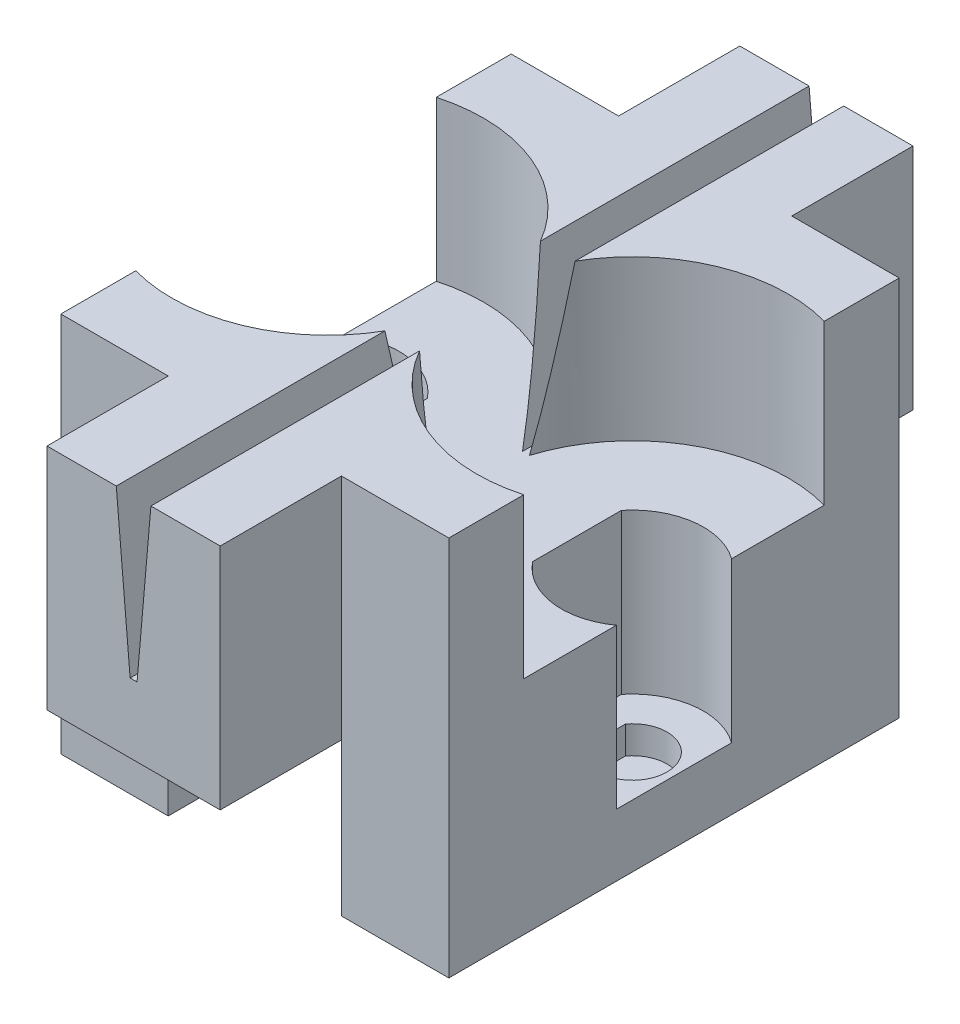
ISO-10303-21;
HEADER;
FILE_DESCRIPTION(('STEP AP214'),'2;1');
FILE_NAME('part.step','',(''),(''),'','','');
FILE_SCHEMA(('AUTOMOTIVE_DESIGN { 1 0 10303 214 1 1 1 1 }'));
ENDSEC;
DATA;
#1=APPLICATION_CONTEXT('core data for automotive mechanical design processes');
#2=APPLICATION_PROTOCOL_DEFINITION('international standard','automotive_design',2000,#1);
#3=PRODUCT_CONTEXT('',#1,'mechanical');
#4=PRODUCT('Part','Part','',(#3));
#5=PRODUCT_RELATED_PRODUCT_CATEGORY('part','',(#4));
#6=PRODUCT_DEFINITION_FORMATION('','',#4);
#7=PRODUCT_DEFINITION_CONTEXT('part definition',#1,'design');
#8=PRODUCT_DEFINITION('design','',#6,#7);
#9=PRODUCT_DEFINITION_SHAPE('','',#8);
#10=(LENGTH_UNIT() NAMED_UNIT(*) SI_UNIT(.MILLI.,.METRE.));
#11=(NAMED_UNIT(*) PLANE_ANGLE_UNIT() SI_UNIT($,.RADIAN.));
#12=(NAMED_UNIT(*) SI_UNIT($,.STERADIAN.) SOLID_ANGLE_UNIT());
#13=UNCERTAINTY_MEASURE_WITH_UNIT(LENGTH_MEASURE(1.E-05),#10,'distance_accuracy_value','');
#14=(GEOMETRIC_REPRESENTATION_CONTEXT(3) GLOBAL_UNCERTAINTY_ASSIGNED_CONTEXT((#13)) GLOBAL_UNIT_ASSIGNED_CONTEXT((#10,
#11,#12)) REPRESENTATION_CONTEXT('',''));
#15=CARTESIAN_POINT('',(0.,0.,0.));
#16=DIRECTION('',(0.,0.,1.));
#17=DIRECTION('',(1.,0.,0.));
#18=AXIS2_PLACEMENT_3D('',#15,#16,#17);
#19=CARTESIAN_POINT('',(0.,0.,0.));
#20=DIRECTION('',(0.,-1.,0.));
#21=DIRECTION('',(0.,0.,-1.));
#22=AXIS2_PLACEMENT_3D('',#19,#20,#21);
#23=PLANE('',#22);
#24=DIRECTION('',(0.,0.,1.));
#25=VECTOR('',#24,1.);
#26=CARTESIAN_POINT('',(-12.5,0.,-50.));
#27=LINE('',#26,#25);
#28=CARTESIAN_POINT('',(-12.5,0.,-32.5));
#29=VERTEX_POINT('',#28);
#30=CARTESIAN_POINT('',(-12.5,0.,32.5));
#31=VERTEX_POINT('',#30);
#32=EDGE_CURVE('E300',#29,#31,#27,.T.);
#33=ORIENTED_EDGE('',*,*,#32,.T.);
#34=DIRECTION('',(-1.,0.,0.));
#35=VECTOR('',#34,1.);
#36=CARTESIAN_POINT('',(-28.,0.,32.5));
#37=LINE('',#36,#35);
#38=CARTESIAN_POINT('',(-28.,0.,32.5));
#39=VERTEX_POINT('',#38);
#40=EDGE_CURVE('E611',#31,#39,#37,.T.);
#41=ORIENTED_EDGE('',*,*,#40,.T.);
#42=DIRECTION('',(0.,0.,1.));
#43=VECTOR('',#42,1.);
#44=CARTESIAN_POINT('',(-28.,0.,50.));
#45=LINE('',#44,#43);
#46=CARTESIAN_POINT('',(-28.,0.,-32.5));
#47=VERTEX_POINT('',#46);
#48=EDGE_CURVE('E467',#47,#39,#45,.T.);
#49=ORIENTED_EDGE('',*,*,#48,.F.);
#50=DIRECTION('',(1.,0.,0.));
#51=VECTOR('',#50,1.);
#52=CARTESIAN_POINT('',(-28.,0.,-32.5));
#53=LINE('',#52,#51);
#54=EDGE_CURVE('E318',#47,#29,#53,.T.);
#55=ORIENTED_EDGE('',*,*,#54,.T.);
#56=EDGE_LOOP('',(#33,#41,#49,#55));
#57=FACE_BOUND('',#56,.T.);
#58=ADVANCED_FACE('F35',(#57),#23,.T.);
#59=CARTESIAN_POINT('',(-14.,9.,-6.40800280898814));
#60=DIRECTION('',(-1.,0.,0.));
#61=DIRECTION('',(0.,0.,1.));
#62=AXIS2_PLACEMENT_3D('',#59,#60,#61);
#63=PLANE('',#62);
#64=DIRECTION('',(0.,0.,-1.));
#65=VECTOR('',#64,1.);
#66=CARTESIAN_POINT('',(-14.,32.,-50.));
#67=LINE('',#66,#65);
#68=CARTESIAN_POINT('',(-14.,32.,6.40800280898814));
#69=VERTEX_POINT('',#68);
#70=CARTESIAN_POINT('',(-14.,32.,-6.40800280898814));
#71=VERTEX_POINT('',#70);
#72=EDGE_CURVE('E340',#69,#71,#67,.T.);
#73=ORIENTED_EDGE('',*,*,#72,.T.);
#74=DIRECTION('',(0.,1.,0.));
#75=VECTOR('',#74,1.);
#76=CARTESIAN_POINT('',(-14.,9.,-6.40800280898814));
#77=LINE('',#76,#75);
#78=CARTESIAN_POINT('',(-14.,9.,-6.40800280898814));
#79=VERTEX_POINT('',#78);
#80=EDGE_CURVE('E337',#79,#71,#77,.T.);
#81=ORIENTED_EDGE('',*,*,#80,.F.);
#82=DIRECTION('',(0.,0.,1.));
#83=VECTOR('',#82,1.);
#84=CARTESIAN_POINT('',(-14.,9.,-6.40800280898814));
#85=LINE('',#84,#83);
#86=CARTESIAN_POINT('',(-14.,9.,6.40800280898814));
#87=VERTEX_POINT('',#86);
#88=EDGE_CURVE('E334',#79,#87,#85,.T.);
#89=ORIENTED_EDGE('',*,*,#88,.T.);
#90=DIRECTION('',(0.,1.,0.));
#91=VECTOR('',#90,1.);
#92=CARTESIAN_POINT('',(-14.,9.,6.40800280898814));
#93=LINE('',#92,#91);
#94=EDGE_CURVE('E336',#87,#69,#93,.T.);
#95=ORIENTED_EDGE('',*,*,#94,.T.);
#96=EDGE_LOOP('',(#73,#81,#89,#95));
#97=FACE_BOUND('',#96,.T.);
#98=ADVANCED_FACE('F584',(#97),#63,.T.);
#99=CARTESIAN_POINT('',(-22.,9.,0.));
#100=DIRECTION('',(0.,-1.,0.));
#101=DIRECTION('',(0.,0.,-1.));
#102=AXIS2_PLACEMENT_3D('',#99,#100,#101);
#103=PLANE('',#102);
#104=CARTESIAN_POINT('',(-22.,9.,0.));
#105=DIRECTION('',(0.,-1.,0.));
#106=DIRECTION('',(0.,0.,-1.));
#107=AXIS2_PLACEMENT_3D('',#104,#105,#106);
#108=CIRCLE('',#107,10.25);
#109=CARTESIAN_POINT('',(-28.,9.,8.3103850692973));
#110=VERTEX_POINT('',#109);
#111=EDGE_CURVE('E331',#87,#110,#108,.T.);
#112=ORIENTED_EDGE('',*,*,#111,.F.);
#113=ORIENTED_EDGE('',*,*,#88,.F.);
#114=CARTESIAN_POINT('',(-28.,9.,-8.31038506929733));
#115=VERTEX_POINT('',#114);
#116=EDGE_CURVE('E329',#115,#79,#108,.T.);
#117=ORIENTED_EDGE('',*,*,#116,.F.);
#118=DIRECTION('',(0.,0.,-1.));
#119=VECTOR('',#118,1.);
#120=CARTESIAN_POINT('',(-28.,9.,50.));
#121=LINE('',#120,#119);
#122=EDGE_CURVE('E11',#110,#115,#121,.T.);
#123=ORIENTED_EDGE('',*,*,#122,.F.);
#124=EDGE_LOOP('',(#112,#113,#117,#123));
#125=FACE_BOUND('',#124,.T.);
#126=CARTESIAN_POINT('',(-22.,9.,0.));
#127=DIRECTION('',(0.,-1.,0.));
#128=DIRECTION('',(0.,0.,-1.));
#129=AXIS2_PLACEMENT_3D('',#126,#127,#128);
#130=CIRCLE('',#129,5.);
#131=CARTESIAN_POINT('',(-18.,9.,3.));
#132=VERTEX_POINT('',#131);
#133=CARTESIAN_POINT('',(-18.,9.,-3.));
#134=VERTEX_POINT('',#133);
#135=EDGE_CURVE('E58',#132,#134,#130,.T.);
#136=ORIENTED_EDGE('',*,*,#135,.T.);
#137=DIRECTION('',(0.,0.,1.));
#138=VECTOR('',#137,1.);
#139=CARTESIAN_POINT('',(-18.,9.,-3.));
#140=LINE('',#139,#138);
#141=EDGE_CURVE('E309',#134,#132,#140,.T.);
#142=ORIENTED_EDGE('',*,*,#141,.T.);
#143=EDGE_LOOP('',(#136,#142));
#144=FACE_BOUND('',#143,.T.);
#145=ADVANCED_FACE('F591',(#125,#144),#103,.F.);
#146=CARTESIAN_POINT('',(-28.,55.,50.));
#147=DIRECTION('',(1.,0.,0.));
#148=DIRECTION('',(0.,0.,-1.));
#149=AXIS2_PLACEMENT_3D('',#146,#147,#148);
#150=PLANE('',#149);
#151=ORIENTED_EDGE('',*,*,#48,.T.);
#152=DIRECTION('',(0.,1.,0.));
#153=VECTOR('',#152,1.);
#154=CARTESIAN_POINT('',(-28.,0.,32.5));
#155=LINE('',#154,#153);
#156=CARTESIAN_POINT('',(-28.,55.,32.5));
#157=VERTEX_POINT('',#156);
#158=EDGE_CURVE('E636',#39,#157,#155,.T.);
#159=ORIENTED_EDGE('',*,*,#158,.T.);
#160=DIRECTION('',(0.,0.,1.));
#161=VECTOR('',#160,1.);
#162=CARTESIAN_POINT('',(-28.,55.,50.));
#163=LINE('',#162,#161);
#164=CARTESIAN_POINT('',(-28.,55.,21.6852484422014));
#165=VERTEX_POINT('',#164);
#166=EDGE_CURVE('E458',#165,#157,#163,.T.);
#167=ORIENTED_EDGE('',*,*,#166,.F.);
#168=DIRECTION('',(0.,1.,0.));
#169=VECTOR('',#168,1.);
#170=CARTESIAN_POINT('',(-28.,32.,21.6852484422014));
#171=LINE('',#170,#169);
#172=CARTESIAN_POINT('',(-28.,32.,21.6852484422014));
#173=VERTEX_POINT('',#172);
#174=EDGE_CURVE('E356',#173,#165,#171,.T.);
#175=ORIENTED_EDGE('',*,*,#174,.F.);
#176=DIRECTION('',(0.,0.,1.));
#177=VECTOR('',#176,1.);
#178=CARTESIAN_POINT('',(-28.,32.,50.));
#179=LINE('',#178,#177);
#180=CARTESIAN_POINT('',(-28.,32.,8.3103850692973));
#181=VERTEX_POINT('',#180);
#182=EDGE_CURVE('E360',#181,#173,#179,.T.);
#183=ORIENTED_EDGE('',*,*,#182,.F.);
#184=DIRECTION('',(0.,1.,0.));
#185=VECTOR('',#184,1.);
#186=CARTESIAN_POINT('',(-28.,9.,8.3103850692973));
#187=LINE('',#186,#185);
#188=EDGE_CURVE('E344',#110,#181,#187,.T.);
#189=ORIENTED_EDGE('',*,*,#188,.F.);
#190=ORIENTED_EDGE('',*,*,#122,.T.);
#191=DIRECTION('',(0.,1.,0.));
#192=VECTOR('',#191,1.);
#193=CARTESIAN_POINT('',(-28.,9.,-8.31038506929733));
#194=LINE('',#193,#192);
#195=CARTESIAN_POINT('',(-28.,32.,-8.31038506929733));
#196=VERTEX_POINT('',#195);
#197=EDGE_CURVE('E346',#196,#115,#194,.F.);
#198=ORIENTED_EDGE('',*,*,#197,.F.);
#199=CARTESIAN_POINT('',(-28.,32.,-21.6852484422015));
#200=VERTEX_POINT('',#199);
#201=EDGE_CURVE('E362',#200,#196,#179,.T.);
#202=ORIENTED_EDGE('',*,*,#201,.F.);
#203=DIRECTION('',(0.,1.,0.));
#204=VECTOR('',#203,1.);
#205=CARTESIAN_POINT('',(-28.,32.,-21.6852484422015));
#206=LINE('',#205,#204);
#207=CARTESIAN_POINT('',(-28.,55.,-21.6852484422015));
#208=VERTEX_POINT('',#207);
#209=EDGE_CURVE('E358',#208,#200,#206,.F.);
#210=ORIENTED_EDGE('',*,*,#209,.F.);
#211=CARTESIAN_POINT('',(-28.,55.,-32.5));
#212=VERTEX_POINT('',#211);
#213=EDGE_CURVE('E459',#212,#208,#163,.T.);
#214=ORIENTED_EDGE('',*,*,#213,.F.);
#215=DIRECTION('',(0.,1.,0.));
#216=VECTOR('',#215,1.);
#217=CARTESIAN_POINT('',(-28.,0.,-32.5));
#218=LINE('',#217,#216);
#219=EDGE_CURVE('E316',#47,#212,#218,.T.);
#220=ORIENTED_EDGE('',*,*,#219,.F.);
#221=EDGE_LOOP('',(#151,#159,#167,#175,#183,#189,#190,#198,#202,#210,#214,#220));
#222=FACE_BOUND('',#221,.T.);
#223=ADVANCED_FACE('F580',(#222),#150,.F.);
#224=CARTESIAN_POINT('',(-0.5,32.,-50.));
#225=DIRECTION('',(0.,-1.,0.));
#226=DIRECTION('',(0.,0.,-1.));
#227=AXIS2_PLACEMENT_3D('',#224,#225,#226);
#228=PLANE('',#227);
#229=ORIENTED_EDGE('',*,*,#72,.F.);
#230=CARTESIAN_POINT('',(-22.,32.,0.));
#231=DIRECTION('',(0.,-1.,0.));
#232=DIRECTION('',(0.,0.,-1.));
#233=AXIS2_PLACEMENT_3D('',#230,#231,#232);
#234=CIRCLE('',#233,10.25);
#235=EDGE_CURVE('E43',#181,#69,#234,.F.);
#236=ORIENTED_EDGE('',*,*,#235,.F.);
#237=ORIENTED_EDGE('',*,*,#182,.T.);
#238=CARTESIAN_POINT('',(-22.,32.,0.));
#239=DIRECTION('',(0.,-1.,0.));
#240=DIRECTION('',(0.,0.,1.));
#241=AXIS2_PLACEMENT_3D('',#238,#239,#240);
#242=CIRCLE('',#241,22.5);
#243=CARTESIAN_POINT('',(-0.500000000000006,32.,6.63324958071084));
#244=VERTEX_POINT('',#243);
#245=EDGE_CURVE('E349',#244,#173,#242,.T.);
#246=ORIENTED_EDGE('',*,*,#245,.F.);
#247=DIRECTION('',(0.,0.,1.));
#248=VECTOR('',#247,1.);
#249=CARTESIAN_POINT('',(-0.5,32.,-50.));
#250=LINE('',#249,#248);
#251=CARTESIAN_POINT('',(-0.5,32.,50.));
#252=VERTEX_POINT('',#251);
#253=EDGE_CURVE('E440',#244,#252,#250,.T.);
#254=ORIENTED_EDGE('',*,*,#253,.T.);
#255=DIRECTION('',(1.,0.,0.));
#256=VECTOR('',#255,1.);
#257=CARTESIAN_POINT('',(-0.5,32.,50.));
#258=LINE('',#257,#256);
#259=CARTESIAN_POINT('',(0.5,32.,50.));
#260=VERTEX_POINT('',#259);
#261=EDGE_CURVE('E417',#252,#260,#258,.T.);
#262=ORIENTED_EDGE('',*,*,#261,.T.);
#263=DIRECTION('',(0.,0.,1.));
#264=VECTOR('',#263,1.);
#265=CARTESIAN_POINT('',(0.5,32.,-50.));
#266=LINE('',#265,#264);
#267=CARTESIAN_POINT('',(0.500000000000007,32.,6.63324958071084));
#268=VERTEX_POINT('',#267);
#269=EDGE_CURVE('E428',#268,#260,#266,.T.);
#270=ORIENTED_EDGE('',*,*,#269,.F.);
#271=CARTESIAN_POINT('',(22.,32.,0.));
#272=DIRECTION('',(0.,1.,0.));
#273=DIRECTION('',(0.,0.,1.));
#274=AXIS2_PLACEMENT_3D('',#271,#272,#273);
#275=CIRCLE('',#274,22.5);
#276=CARTESIAN_POINT('',(28.,32.,21.6852484422014));
#277=VERTEX_POINT('',#276);
#278=EDGE_CURVE('E401',#268,#277,#275,.T.);
#279=ORIENTED_EDGE('',*,*,#278,.T.);
#280=DIRECTION('',(0.,0.,-1.));
#281=VECTOR('',#280,1.);
#282=CARTESIAN_POINT('',(28.,32.,50.));
#283=LINE('',#282,#281);
#284=CARTESIAN_POINT('',(28.,32.,8.3103850692973));
#285=VERTEX_POINT('',#284);
#286=EDGE_CURVE('E410',#277,#285,#283,.T.);
#287=ORIENTED_EDGE('',*,*,#286,.T.);
#288=CARTESIAN_POINT('',(22.,32.,0.));
#289=DIRECTION('',(0.,-1.,0.));
#290=DIRECTION('',(0.,0.,-1.));
#291=AXIS2_PLACEMENT_3D('',#288,#289,#290);
#292=CIRCLE('',#291,10.25);
#293=CARTESIAN_POINT('',(14.,32.,6.40800280898814));
#294=VERTEX_POINT('',#293);
#295=EDGE_CURVE('E476',#285,#294,#292,.T.);
#296=ORIENTED_EDGE('',*,*,#295,.T.);
#297=DIRECTION('',(0.,0.,-1.));
#298=VECTOR('',#297,1.);
#299=CARTESIAN_POINT('',(14.,32.,-50.));
#300=LINE('',#299,#298);
#301=CARTESIAN_POINT('',(14.,32.,-6.40800280898814));
#302=VERTEX_POINT('',#301);
#303=EDGE_CURVE('E390',#294,#302,#300,.T.);
#304=ORIENTED_EDGE('',*,*,#303,.T.);
#305=CARTESIAN_POINT('',(28.,32.,-8.31038506929733));
#306=VERTEX_POINT('',#305);
#307=EDGE_CURVE('E473',#302,#306,#292,.T.);
#308=ORIENTED_EDGE('',*,*,#307,.T.);
#309=CARTESIAN_POINT('',(28.,32.,-21.6852484422015));
#310=VERTEX_POINT('',#309);
#311=EDGE_CURVE('E408',#306,#310,#283,.T.);
#312=ORIENTED_EDGE('',*,*,#311,.T.);
#313=CARTESIAN_POINT('',(0.5,32.,-6.63324958071086));
#314=VERTEX_POINT('',#313);
#315=EDGE_CURVE('E404',#310,#314,#275,.T.);
#316=ORIENTED_EDGE('',*,*,#315,.T.);
#317=CARTESIAN_POINT('',(0.5,32.,-50.));
#318=VERTEX_POINT('',#317);
#319=EDGE_CURVE('E449',#318,#314,#266,.T.);
#320=ORIENTED_EDGE('',*,*,#319,.F.);
#321=DIRECTION('',(1.,0.,0.));
#322=VECTOR('',#321,1.);
#323=CARTESIAN_POINT('',(-0.5,32.,-50.));
#324=LINE('',#323,#322);
#325=CARTESIAN_POINT('',(-0.5,32.,-50.));
#326=VERTEX_POINT('',#325);
#327=EDGE_CURVE('E418',#326,#318,#324,.T.);
#328=ORIENTED_EDGE('',*,*,#327,.F.);
#329=CARTESIAN_POINT('',(-0.5,32.,-6.63324958071086));
#330=VERTEX_POINT('',#329);
#331=EDGE_CURVE('E436',#326,#330,#250,.T.);
#332=ORIENTED_EDGE('',*,*,#331,.T.);
#333=EDGE_CURVE('E352',#200,#330,#242,.T.);
#334=ORIENTED_EDGE('',*,*,#333,.F.);
#335=ORIENTED_EDGE('',*,*,#201,.T.);
#336=EDGE_CURVE('E482',#71,#196,#234,.F.);
#337=ORIENTED_EDGE('',*,*,#336,.F.);
#338=EDGE_LOOP('',(#229,#236,#237,#246,#254,#262,#270,#279,#287,#296,#304,#308,#312,#316,#320,
#328,#332,#334,#335,#337));
#339=FACE_BOUND('',#338,.T.);
#340=ADVANCED_FACE('F497',(#339),#228,.F.);
#341=CARTESIAN_POINT('',(0.,55.,0.));
#342=DIRECTION('',(0.,-1.,0.));
#343=DIRECTION('',(0.,0.,-1.));
#344=AXIS2_PLACEMENT_3D('',#341,#342,#343);
#345=PLANE('',#344);
#346=ORIENTED_EDGE('',*,*,#166,.T.);
#347=DIRECTION('',(-1.,0.,0.));
#348=VECTOR('',#347,1.);
#349=CARTESIAN_POINT('',(-28.,55.,32.5));
#350=LINE('',#349,#348);
#351=CARTESIAN_POINT('',(-12.5,55.,32.5));
#352=VERTEX_POINT('',#351);
#353=EDGE_CURVE('E616',#352,#157,#350,.T.);
#354=ORIENTED_EDGE('',*,*,#353,.F.);
#355=DIRECTION('',(0.,0.,-1.));
#356=VECTOR('',#355,1.);
#357=CARTESIAN_POINT('',(-12.5,55.,50.));
#358=LINE('',#357,#356);
#359=CARTESIAN_POINT('',(-12.5,55.,50.));
#360=VERTEX_POINT('',#359);
#361=EDGE_CURVE('E604',#360,#352,#358,.T.);
#362=ORIENTED_EDGE('',*,*,#361,.F.);
#363=DIRECTION('',(1.,0.,0.));
#364=VECTOR('',#363,1.);
#365=CARTESIAN_POINT('',(-28.,55.,50.));
#366=LINE('',#365,#364);
#367=CARTESIAN_POINT('',(-2.5,55.,50.));
#368=VERTEX_POINT('',#367);
#369=EDGE_CURVE('E462',#360,#368,#366,.T.);
#370=ORIENTED_EDGE('',*,*,#369,.T.);
#371=DIRECTION('',(0.,0.,1.));
#372=VECTOR('',#371,1.);
#373=CARTESIAN_POINT('',(-2.5,55.,-50.));
#374=LINE('',#373,#372);
#375=CARTESIAN_POINT('',(-2.50000000000001,55.,11.2249721603218));
#376=VERTEX_POINT('',#375);
#377=EDGE_CURVE('E444',#376,#368,#374,.T.);
#378=ORIENTED_EDGE('',*,*,#377,.F.);
#379=CARTESIAN_POINT('',(-22.,55.,0.));
#380=DIRECTION('',(0.,-1.,0.));
#381=DIRECTION('',(0.,0.,1.));
#382=AXIS2_PLACEMENT_3D('',#379,#380,#381);
#383=CIRCLE('',#382,22.5);
#384=EDGE_CURVE('E348',#376,#165,#383,.T.);
#385=ORIENTED_EDGE('',*,*,#384,.T.);
#386=EDGE_LOOP('',(#346,#354,#362,#370,#378,#385));
#387=FACE_BOUND('',#386,.T.);
#388=ADVANCED_FACE('F600',(#387),#345,.F.);
#389=CARTESIAN_POINT('',(-0.5,32.,-50.));
#390=DIRECTION('',(-0.996240588195683,-0.0866296163648421,0.));
#391=DIRECTION('',(0.0866296163648421,-0.996240588195683,0.));
#392=AXIS2_PLACEMENT_3D('',#389,#390,#391);
#393=PLANE('',#392);
#394=CARTESIAN_POINT('',(-22.,279.25,0.));
#395=DIRECTION('',(-0.996240588195683,-0.0866296163648421,0.));
#396=DIRECTION('',(-0.0866296163648421,0.996240588195683,0.));
#397=AXIS2_PLACEMENT_3D('',#394,#395,#396);
#398=ELLIPSE('',#397,259.726418563842,22.5);
#399=EDGE_CURVE('E481',#376,#244,#398,.F.);
#400=ORIENTED_EDGE('',*,*,#399,.F.);
#401=ORIENTED_EDGE('',*,*,#377,.T.);
#402=DIRECTION('',(0.0866296163648421,-0.996240588195683,0.));
#403=VECTOR('',#402,1.);
#404=CARTESIAN_POINT('',(-0.5,32.,50.));
#405=LINE('',#404,#403);
#406=EDGE_CURVE('E422',#368,#252,#405,.T.);
#407=ORIENTED_EDGE('',*,*,#406,.T.);
#408=ORIENTED_EDGE('',*,*,#253,.F.);
#409=EDGE_LOOP('',(#400,#401,#407,#408));
#410=FACE_BOUND('',#409,.T.);
#411=ADVANCED_FACE('F500',(#410),#393,.F.);
#412=CARTESIAN_POINT('',(14.,9.,-6.40800280898814));
#413=DIRECTION('',(-1.,0.,0.));
#414=DIRECTION('',(0.,0.,1.));
#415=AXIS2_PLACEMENT_3D('',#412,#413,#414);
#416=PLANE('',#415);
#417=DIRECTION('',(0.,1.,0.));
#418=VECTOR('',#417,1.);
#419=CARTESIAN_POINT('',(14.,9.,-6.40800280898814));
#420=LINE('',#419,#418);
#421=CARTESIAN_POINT('',(14.,9.,-6.40800280898814));
#422=VERTEX_POINT('',#421);
#423=EDGE_CURVE('E386',#422,#302,#420,.T.);
#424=ORIENTED_EDGE('',*,*,#423,.T.);
#425=ORIENTED_EDGE('',*,*,#303,.F.);
#426=DIRECTION('',(0.,1.,0.));
#427=VECTOR('',#426,1.);
#428=CARTESIAN_POINT('',(14.,9.,6.40800280898814));
#429=LINE('',#428,#427);
#430=CARTESIAN_POINT('',(14.,9.,6.40800280898814));
#431=VERTEX_POINT('',#430);
#432=EDGE_CURVE('E387',#431,#294,#429,.T.);
#433=ORIENTED_EDGE('',*,*,#432,.F.);
#434=DIRECTION('',(0.,0.,1.));
#435=VECTOR('',#434,1.);
#436=CARTESIAN_POINT('',(14.,9.,-6.40800280898814));
#437=LINE('',#436,#435);
#438=EDGE_CURVE('E383',#422,#431,#437,.T.);
#439=ORIENTED_EDGE('',*,*,#438,.F.);
#440=EDGE_LOOP('',(#424,#425,#433,#439));
#441=FACE_BOUND('',#440,.T.);
#442=ADVANCED_FACE('F537',(#441),#416,.F.);
#443=CARTESIAN_POINT('',(2.5,55.,50.));
#444=VERTEX_POINT('',#443);
#445=CARTESIAN_POINT('',(12.5,55.,50.));
#446=VERTEX_POINT('',#445);
#447=EDGE_CURVE('E461',#444,#446,#366,.T.);
#448=ORIENTED_EDGE('',*,*,#447,.T.);
#449=DIRECTION('',(0.,0.,1.));
#450=VECTOR('',#449,1.);
#451=CARTESIAN_POINT('',(12.5,55.,50.));
#452=LINE('',#451,#450);
#453=CARTESIAN_POINT('',(12.5,55.,32.5));
#454=VERTEX_POINT('',#453);
#455=EDGE_CURVE('E658',#454,#446,#452,.T.);
#456=ORIENTED_EDGE('',*,*,#455,.F.);
#457=DIRECTION('',(-1.,0.,0.));
#458=VECTOR('',#457,1.);
#459=CARTESIAN_POINT('',(28.,55.,32.5));
#460=LINE('',#459,#458);
#461=CARTESIAN_POINT('',(28.,55.,32.5));
#462=VERTEX_POINT('',#461);
#463=EDGE_CURVE('E289',#462,#454,#460,.T.);
#464=ORIENTED_EDGE('',*,*,#463,.F.);
#465=DIRECTION('',(0.,0.,-1.));
#466=VECTOR('',#465,1.);
#467=CARTESIAN_POINT('',(28.,55.,50.));
#468=LINE('',#467,#466);
#469=CARTESIAN_POINT('',(28.,55.,21.6852484422014));
#470=VERTEX_POINT('',#469);
#471=EDGE_CURVE('E452',#462,#470,#468,.T.);
#472=ORIENTED_EDGE('',*,*,#471,.T.);
#473=CARTESIAN_POINT('',(22.,55.,0.));
#474=DIRECTION('',(0.,1.,0.));
#475=DIRECTION('',(0.,0.,1.));
#476=AXIS2_PLACEMENT_3D('',#473,#474,#475);
#477=CIRCLE('',#476,22.5);
#478=CARTESIAN_POINT('',(2.50000000000001,55.,11.2249721603218));
#479=VERTEX_POINT('',#478);
#480=EDGE_CURVE('E400',#479,#470,#477,.T.);
#481=ORIENTED_EDGE('',*,*,#480,.F.);
#482=DIRECTION('',(0.,0.,1.));
#483=VECTOR('',#482,1.);
#484=CARTESIAN_POINT('',(2.5,55.,-50.));
#485=LINE('',#484,#483);
#486=EDGE_CURVE('E448',#479,#444,#485,.T.);
#487=ORIENTED_EDGE('',*,*,#486,.T.);
#488=EDGE_LOOP('',(#448,#456,#464,#472,#481,#487));
#489=FACE_BOUND('',#488,.T.);
#490=ADVANCED_FACE('F521',(#489),#345,.F.);
#491=CARTESIAN_POINT('',(2.5,55.,-50.));
#492=DIRECTION('',(0.996240588195683,-0.0866296163648419,0.));
#493=DIRECTION('',(0.0866296163648419,0.996240588195683,0.));
#494=AXIS2_PLACEMENT_3D('',#491,#492,#493);
#495=PLANE('',#494);
#496=ORIENTED_EDGE('',*,*,#486,.F.);
#497=CARTESIAN_POINT('',(22.,279.25,0.));
#498=DIRECTION('',(0.996240588195683,-0.0866296163648419,0.));
#499=DIRECTION('',(0.0866296163648419,0.996240588195683,0.));
#500=AXIS2_PLACEMENT_3D('',#497,#498,#499);
#501=ELLIPSE('',#500,259.726418563842,22.5);
#502=EDGE_CURVE('E472',#479,#268,#501,.T.);
#503=ORIENTED_EDGE('',*,*,#502,.T.);
#504=ORIENTED_EDGE('',*,*,#269,.T.);
#505=DIRECTION('',(0.0866296163648419,0.996240588195683,0.));
#506=VECTOR('',#505,1.);
#507=CARTESIAN_POINT('',(2.5,55.,50.));
#508=LINE('',#507,#506);
#509=EDGE_CURVE('E431',#260,#444,#508,.T.);
#510=ORIENTED_EDGE('',*,*,#509,.T.);
#511=EDGE_LOOP('',(#496,#503,#504,#510));
#512=FACE_BOUND('',#511,.T.);
#513=ADVANCED_FACE('F515',(#512),#495,.F.);
#514=DIRECTION('',(-1.,0.,0.));
#515=VECTOR('',#514,1.);
#516=CARTESIAN_POINT('',(-28.,55.,-50.));
#517=LINE('',#516,#515);
#518=CARTESIAN_POINT('',(-2.5,55.,-50.));
#519=VERTEX_POINT('',#518);
#520=CARTESIAN_POINT('',(-12.5,55.,-50.));
#521=VERTEX_POINT('',#520);
#522=EDGE_CURVE('E454',#519,#521,#517,.T.);
#523=ORIENTED_EDGE('',*,*,#522,.T.);
#524=DIRECTION('',(0.,0.,-1.));
#525=VECTOR('',#524,1.);
#526=CARTESIAN_POINT('',(-12.5,55.,-50.));
#527=LINE('',#526,#525);
#528=CARTESIAN_POINT('',(-12.5,55.,-32.5));
#529=VERTEX_POINT('',#528);
#530=EDGE_CURVE('E305',#529,#521,#527,.T.);
#531=ORIENTED_EDGE('',*,*,#530,.F.);
#532=DIRECTION('',(1.,0.,0.));
#533=VECTOR('',#532,1.);
#534=CARTESIAN_POINT('',(-28.,55.,-32.5));
#535=LINE('',#534,#533);
#536=EDGE_CURVE('E577',#212,#529,#535,.T.);
#537=ORIENTED_EDGE('',*,*,#536,.F.);
#538=ORIENTED_EDGE('',*,*,#213,.T.);
#539=CARTESIAN_POINT('',(-2.50000000000001,55.,-11.2249721603219));
#540=VERTEX_POINT('',#539);
#541=EDGE_CURVE('E353',#208,#540,#383,.T.);
#542=ORIENTED_EDGE('',*,*,#541,.T.);
#543=EDGE_CURVE('E441',#519,#540,#374,.T.);
#544=ORIENTED_EDGE('',*,*,#543,.F.);
#545=EDGE_LOOP('',(#523,#531,#537,#538,#542,#544));
#546=FACE_BOUND('',#545,.T.);
#547=ADVANCED_FACE('F573',(#546),#345,.F.);
#548=CARTESIAN_POINT('',(28.,55.,50.));
#549=DIRECTION('',(-1.,0.,0.));
#550=DIRECTION('',(0.,0.,1.));
#551=AXIS2_PLACEMENT_3D('',#548,#549,#550);
#552=PLANE('',#551);
#553=DIRECTION('',(0.,0.,-1.));
#554=VECTOR('',#553,1.);
#555=CARTESIAN_POINT('',(28.,0.,50.));
#556=LINE('',#555,#554);
#557=CARTESIAN_POINT('',(28.,0.,32.5));
#558=VERTEX_POINT('',#557);
#559=CARTESIAN_POINT('',(28.,0.,-32.5));
#560=VERTEX_POINT('',#559);
#561=EDGE_CURVE('E439',#558,#560,#556,.T.);
#562=ORIENTED_EDGE('',*,*,#561,.T.);
#563=DIRECTION('',(0.,1.,0.));
#564=VECTOR('',#563,1.);
#565=CARTESIAN_POINT('',(28.,0.,-32.5));
#566=LINE('',#565,#564);
#567=CARTESIAN_POINT('',(28.,55.,-32.5));
#568=VERTEX_POINT('',#567);
#569=EDGE_CURVE('E621',#560,#568,#566,.T.);
#570=ORIENTED_EDGE('',*,*,#569,.T.);
#571=CARTESIAN_POINT('',(28.,55.,-21.6852484422015));
#572=VERTEX_POINT('',#571);
#573=EDGE_CURVE('E455',#572,#568,#468,.T.);
#574=ORIENTED_EDGE('',*,*,#573,.F.);
#575=DIRECTION('',(0.,1.,0.));
#576=VECTOR('',#575,1.);
#577=CARTESIAN_POINT('',(28.,32.,-21.6852484422015));
#578=LINE('',#577,#576);
#579=EDGE_CURVE('E411',#572,#310,#578,.F.);
#580=ORIENTED_EDGE('',*,*,#579,.T.);
#581=ORIENTED_EDGE('',*,*,#311,.F.);
#582=DIRECTION('',(0.,1.,0.));
#583=VECTOR('',#582,1.);
#584=CARTESIAN_POINT('',(28.,9.,-8.31038506929733));
#585=LINE('',#584,#583);
#586=CARTESIAN_POINT('',(28.,9.,-8.31038506929733));
#587=VERTEX_POINT('',#586);
#588=EDGE_CURVE('E397',#306,#587,#585,.F.);
#589=ORIENTED_EDGE('',*,*,#588,.T.);
#590=DIRECTION('',(0.,0.,1.));
#591=VECTOR('',#590,1.);
#592=CARTESIAN_POINT('',(28.,9.,50.));
#593=LINE('',#592,#591);
#594=CARTESIAN_POINT('',(28.,9.,8.3103850692973));
#595=VERTEX_POINT('',#594);
#596=EDGE_CURVE('E477',#587,#595,#593,.T.);
#597=ORIENTED_EDGE('',*,*,#596,.T.);
#598=DIRECTION('',(0.,1.,0.));
#599=VECTOR('',#598,1.);
#600=CARTESIAN_POINT('',(28.,9.,8.3103850692973));
#601=LINE('',#600,#599);
#602=EDGE_CURVE('E394',#595,#285,#601,.T.);
#603=ORIENTED_EDGE('',*,*,#602,.T.);
#604=ORIENTED_EDGE('',*,*,#286,.F.);
#605=DIRECTION('',(0.,1.,0.));
#606=VECTOR('',#605,1.);
#607=CARTESIAN_POINT('',(28.,32.,21.6852484422014));
#608=LINE('',#607,#606);
#609=EDGE_CURVE('E414',#277,#470,#608,.T.);
#610=ORIENTED_EDGE('',*,*,#609,.T.);
#611=ORIENTED_EDGE('',*,*,#471,.F.);
#612=DIRECTION('',(0.,1.,0.));
#613=VECTOR('',#612,1.);
#614=CARTESIAN_POINT('',(28.,0.,32.5));
#615=LINE('',#614,#613);
#616=EDGE_CURVE('E528',#558,#462,#615,.T.);
#617=ORIENTED_EDGE('',*,*,#616,.F.);
#618=EDGE_LOOP('',(#562,#570,#574,#580,#581,#589,#597,#603,#604,#610,#611,#617));
#619=FACE_BOUND('',#618,.T.);
#620=ADVANCED_FACE('F37',(#619),#552,.F.);
#621=CARTESIAN_POINT('',(-28.,55.,-50.));
#622=DIRECTION('',(0.,0.,1.));
#623=DIRECTION('',(1.,0.,0.));
#624=AXIS2_PLACEMENT_3D('',#621,#622,#623);
#625=PLANE('',#624);
#626=DIRECTION('',(0.,1.,0.));
#627=VECTOR('',#626,1.);
#628=CARTESIAN_POINT('',(12.5,0.,-50.));
#629=LINE('',#628,#627);
#630=CARTESIAN_POINT('',(12.5,22.,-50.));
#631=VERTEX_POINT('',#630);
#632=CARTESIAN_POINT('',(12.5,55.,-50.));
#633=VERTEX_POINT('',#632);
#634=EDGE_CURVE('E299',#631,#633,#629,.T.);
#635=ORIENTED_EDGE('',*,*,#634,.F.);
#636=DIRECTION('',(-1.,0.,0.));
#637=VECTOR('',#636,1.);
#638=CARTESIAN_POINT('',(-12.5,22.,-50.));
#639=LINE('',#638,#637);
#640=CARTESIAN_POINT('',(-12.5,22.,-50.));
#641=VERTEX_POINT('',#640);
#642=EDGE_CURVE('E50',#631,#641,#639,.T.);
#643=ORIENTED_EDGE('',*,*,#642,.T.);
#644=DIRECTION('',(0.,1.,0.));
#645=VECTOR('',#644,1.);
#646=CARTESIAN_POINT('',(-12.5,0.,-50.));
#647=LINE('',#646,#645);
#648=EDGE_CURVE('E296',#641,#521,#647,.T.);
#649=ORIENTED_EDGE('',*,*,#648,.T.);
#650=ORIENTED_EDGE('',*,*,#522,.F.);
#651=DIRECTION('',(0.0866296163648421,-0.996240588195683,0.));
#652=VECTOR('',#651,1.);
#653=CARTESIAN_POINT('',(-0.5,32.,-50.));
#654=LINE('',#653,#652);
#655=EDGE_CURVE('E425',#519,#326,#654,.T.);
#656=ORIENTED_EDGE('',*,*,#655,.T.);
#657=ORIENTED_EDGE('',*,*,#327,.T.);
#658=DIRECTION('',(0.0866296163648419,0.996240588195683,0.));
#659=VECTOR('',#658,1.);
#660=CARTESIAN_POINT('',(2.5,55.,-50.));
#661=LINE('',#660,#659);
#662=CARTESIAN_POINT('',(2.5,55.,-50.));
#663=VERTEX_POINT('',#662);
#664=EDGE_CURVE('E421',#318,#663,#661,.T.);
#665=ORIENTED_EDGE('',*,*,#664,.T.);
#666=EDGE_CURVE('E456',#633,#663,#517,.T.);
#667=ORIENTED_EDGE('',*,*,#666,.F.);
#668=EDGE_LOOP('',(#635,#643,#649,#650,#656,#657,#665,#667));
#669=FACE_BOUND('',#668,.T.);
#670=ADVANCED_FACE('F294',(#669),#625,.F.);
#671=CARTESIAN_POINT('',(-28.,55.,50.));
#672=DIRECTION('',(0.,0.,-1.));
#673=DIRECTION('',(-1.,0.,0.));
#674=AXIS2_PLACEMENT_3D('',#671,#672,#673);
#675=PLANE('',#674);
#676=DIRECTION('',(0.,1.,0.));
#677=VECTOR('',#676,1.);
#678=CARTESIAN_POINT('',(-12.5,0.,50.));
#679=LINE('',#678,#677);
#680=CARTESIAN_POINT('',(-12.5,22.,50.));
#681=VERTEX_POINT('',#680);
#682=EDGE_CURVE('E606',#681,#360,#679,.T.);
#683=ORIENTED_EDGE('',*,*,#682,.F.);
#684=DIRECTION('',(-1.,0.,0.));
#685=VECTOR('',#684,1.);
#686=CARTESIAN_POINT('',(-12.5,22.,50.));
#687=LINE('',#686,#685);
#688=CARTESIAN_POINT('',(12.5,22.,50.));
#689=VERTEX_POINT('',#688);
#690=EDGE_CURVE('E301',#689,#681,#687,.T.);
#691=ORIENTED_EDGE('',*,*,#690,.F.);
#692=DIRECTION('',(0.,1.,0.));
#693=VECTOR('',#692,1.);
#694=CARTESIAN_POINT('',(12.5,0.,50.));
#695=LINE('',#694,#693);
#696=EDGE_CURVE('E635',#689,#446,#695,.T.);
#697=ORIENTED_EDGE('',*,*,#696,.T.);
#698=ORIENTED_EDGE('',*,*,#447,.F.);
#699=ORIENTED_EDGE('',*,*,#509,.F.);
#700=ORIENTED_EDGE('',*,*,#261,.F.);
#701=ORIENTED_EDGE('',*,*,#406,.F.);
#702=ORIENTED_EDGE('',*,*,#369,.F.);
#703=EDGE_LOOP('',(#683,#691,#697,#698,#699,#700,#701,#702));
#704=FACE_BOUND('',#703,.T.);
#705=ADVANCED_FACE('F507',(#704),#675,.F.);
#706=ORIENTED_EDGE('',*,*,#573,.T.);
#707=DIRECTION('',(1.,0.,0.));
#708=VECTOR('',#707,1.);
#709=CARTESIAN_POINT('',(28.,55.,-32.5));
#710=LINE('',#709,#708);
#711=CARTESIAN_POINT('',(12.5,55.,-32.5));
#712=VERTEX_POINT('',#711);
#713=EDGE_CURVE('E629',#712,#568,#710,.T.);
#714=ORIENTED_EDGE('',*,*,#713,.F.);
#715=DIRECTION('',(0.,0.,1.));
#716=VECTOR('',#715,1.);
#717=CARTESIAN_POINT('',(12.5,55.,-50.));
#718=LINE('',#717,#716);
#719=EDGE_CURVE('E637',#633,#712,#718,.T.);
#720=ORIENTED_EDGE('',*,*,#719,.F.);
#721=ORIENTED_EDGE('',*,*,#666,.T.);
#722=CARTESIAN_POINT('',(2.50000000000001,55.,-11.2249721603219));
#723=VERTEX_POINT('',#722);
#724=EDGE_CURVE('E445',#663,#723,#485,.T.);
#725=ORIENTED_EDGE('',*,*,#724,.T.);
#726=EDGE_CURVE('E405',#572,#723,#477,.T.);
#727=ORIENTED_EDGE('',*,*,#726,.F.);
#728=EDGE_LOOP('',(#706,#714,#720,#721,#725,#727));
#729=FACE_BOUND('',#728,.T.);
#730=ADVANCED_FACE('F552',(#729),#345,.F.);
#731=DIRECTION('',(0.,0.,1.));
#732=VECTOR('',#731,1.);
#733=CARTESIAN_POINT('',(12.5,0.,-50.));
#734=LINE('',#733,#732);
#735=CARTESIAN_POINT('',(12.5,0.,-32.5));
#736=VERTEX_POINT('',#735);
#737=CARTESIAN_POINT('',(12.5,0.,32.5));
#738=VERTEX_POINT('',#737);
#739=EDGE_CURVE('E649',#736,#738,#734,.T.);
#740=ORIENTED_EDGE('',*,*,#739,.F.);
#741=DIRECTION('',(1.,0.,0.));
#742=VECTOR('',#741,1.);
#743=CARTESIAN_POINT('',(28.,0.,-32.5));
#744=LINE('',#743,#742);
#745=EDGE_CURVE('E632',#736,#560,#744,.T.);
#746=ORIENTED_EDGE('',*,*,#745,.T.);
#747=ORIENTED_EDGE('',*,*,#561,.F.);
#748=DIRECTION('',(-1.,0.,0.));
#749=VECTOR('',#748,1.);
#750=CARTESIAN_POINT('',(28.,0.,32.5));
#751=LINE('',#750,#749);
#752=EDGE_CURVE('E655',#558,#738,#751,.T.);
#753=ORIENTED_EDGE('',*,*,#752,.T.);
#754=EDGE_LOOP('',(#740,#746,#747,#753));
#755=FACE_BOUND('',#754,.T.);
#756=ADVANCED_FACE('F686',(#755),#23,.T.);
#757=EDGE_CURVE('E480',#330,#540,#398,.F.);
#758=ORIENTED_EDGE('',*,*,#757,.F.);
#759=ORIENTED_EDGE('',*,*,#331,.F.);
#760=ORIENTED_EDGE('',*,*,#655,.F.);
#761=ORIENTED_EDGE('',*,*,#543,.T.);
#762=EDGE_LOOP('',(#758,#759,#760,#761));
#763=FACE_BOUND('',#762,.T.);
#764=ADVANCED_FACE('F565',(#763),#393,.F.);
#765=ORIENTED_EDGE('',*,*,#319,.T.);
#766=EDGE_CURVE('E464',#314,#723,#501,.T.);
#767=ORIENTED_EDGE('',*,*,#766,.T.);
#768=ORIENTED_EDGE('',*,*,#724,.F.);
#769=ORIENTED_EDGE('',*,*,#664,.F.);
#770=EDGE_LOOP('',(#765,#767,#768,#769));
#771=FACE_BOUND('',#770,.T.);
#772=ADVANCED_FACE('F558',(#771),#495,.F.);
#773=CARTESIAN_POINT('',(22.,32.,0.));
#774=DIRECTION('',(0.,1.,0.));
#775=DIRECTION('',(0.,0.,1.));
#776=AXIS2_PLACEMENT_3D('',#773,#774,#775);
#777=CYLINDRICAL_SURFACE('',#776,22.5);
#778=ORIENTED_EDGE('',*,*,#278,.F.);
#779=ORIENTED_EDGE('',*,*,#502,.F.);
#780=ORIENTED_EDGE('',*,*,#480,.T.);
#781=ORIENTED_EDGE('',*,*,#609,.F.);
#782=EDGE_LOOP('',(#778,#779,#780,#781));
#783=FACE_BOUND('',#782,.T.);
#784=ADVANCED_FACE('F518',(#783),#777,.F.);
#785=ORIENTED_EDGE('',*,*,#726,.T.);
#786=ORIENTED_EDGE('',*,*,#766,.F.);
#787=ORIENTED_EDGE('',*,*,#315,.F.);
#788=ORIENTED_EDGE('',*,*,#579,.F.);
#789=EDGE_LOOP('',(#785,#786,#787,#788));
#790=FACE_BOUND('',#789,.T.);
#791=ADVANCED_FACE('F549',(#790),#777,.F.);
#792=CARTESIAN_POINT('',(22.,9.,0.));
#793=DIRECTION('',(0.,-1.,0.));
#794=DIRECTION('',(0.,0.,-1.));
#795=AXIS2_PLACEMENT_3D('',#792,#793,#794);
#796=PLANE('',#795);
#797=DIRECTION('',(0.,0.,1.));
#798=VECTOR('',#797,1.);
#799=CARTESIAN_POINT('',(18.,9.,-3.));
#800=LINE('',#799,#798);
#801=CARTESIAN_POINT('',(18.,9.,-3.));
#802=VERTEX_POINT('',#801);
#803=CARTESIAN_POINT('',(18.,9.,3.));
#804=VERTEX_POINT('',#803);
#805=EDGE_CURVE('E367',#802,#804,#800,.T.);
#806=ORIENTED_EDGE('',*,*,#805,.F.);
#807=CARTESIAN_POINT('',(22.,9.,0.));
#808=DIRECTION('',(0.,1.,0.));
#809=DIRECTION('',(0.,0.,-1.));
#810=AXIS2_PLACEMENT_3D('',#807,#808,#809);
#811=CIRCLE('',#810,5.);
#812=EDGE_CURVE('E371',#804,#802,#811,.T.);
#813=ORIENTED_EDGE('',*,*,#812,.F.);
#814=EDGE_LOOP('',(#806,#813));
#815=FACE_BOUND('',#814,.T.);
#816=CARTESIAN_POINT('',(22.,9.,0.));
#817=DIRECTION('',(0.,1.,0.));
#818=DIRECTION('',(0.,0.,-1.));
#819=AXIS2_PLACEMENT_3D('',#816,#817,#818);
#820=CIRCLE('',#819,10.25);
#821=EDGE_CURVE('E377',#587,#422,#820,.T.);
#822=ORIENTED_EDGE('',*,*,#821,.T.);
#823=ORIENTED_EDGE('',*,*,#438,.T.);
#824=EDGE_CURVE('E380',#431,#595,#820,.T.);
#825=ORIENTED_EDGE('',*,*,#824,.T.);
#826=ORIENTED_EDGE('',*,*,#596,.F.);
#827=EDGE_LOOP('',(#822,#823,#825,#826));
#828=FACE_BOUND('',#827,.T.);
#829=ADVANCED_FACE('F732',(#815,#828),#796,.F.);
#830=CARTESIAN_POINT('',(22.,9.,0.));
#831=DIRECTION('',(0.,1.,0.));
#832=DIRECTION('',(0.,0.,1.));
#833=AXIS2_PLACEMENT_3D('',#830,#831,#832);
#834=CYLINDRICAL_SURFACE('',#833,10.25);
#835=ORIENTED_EDGE('',*,*,#307,.F.);
#836=ORIENTED_EDGE('',*,*,#423,.F.);
#837=ORIENTED_EDGE('',*,*,#821,.F.);
#838=ORIENTED_EDGE('',*,*,#588,.F.);
#839=EDGE_LOOP('',(#835,#836,#837,#838));
#840=FACE_BOUND('',#839,.T.);
#841=ADVANCED_FACE('F541',(#840),#834,.F.);
#842=ORIENTED_EDGE('',*,*,#824,.F.);
#843=ORIENTED_EDGE('',*,*,#432,.T.);
#844=ORIENTED_EDGE('',*,*,#295,.F.);
#845=ORIENTED_EDGE('',*,*,#602,.F.);
#846=EDGE_LOOP('',(#842,#843,#844,#845));
#847=FACE_BOUND('',#846,.T.);
#848=ADVANCED_FACE('F534',(#847),#834,.F.);
#849=CARTESIAN_POINT('',(22.,5.,0.));
#850=DIRECTION('',(0.,1.,0.));
#851=DIRECTION('',(0.,0.,1.));
#852=AXIS2_PLACEMENT_3D('',#849,#850,#851);
#853=CYLINDRICAL_SURFACE('',#852,5.);
#854=ORIENTED_EDGE('',*,*,#812,.T.);
#855=DIRECTION('',(0.,1.,0.));
#856=VECTOR('',#855,1.);
#857=CARTESIAN_POINT('',(18.,5.,-3.));
#858=LINE('',#857,#856);
#859=CARTESIAN_POINT('',(18.,5.,-3.));
#860=VERTEX_POINT('',#859);
#861=EDGE_CURVE('E370',#860,#802,#858,.T.);
#862=ORIENTED_EDGE('',*,*,#861,.F.);
#863=CARTESIAN_POINT('',(22.,5.,0.));
#864=DIRECTION('',(0.,1.,0.));
#865=DIRECTION('',(0.,0.,-1.));
#866=AXIS2_PLACEMENT_3D('',#863,#864,#865);
#867=CIRCLE('',#866,5.);
#868=CARTESIAN_POINT('',(18.,5.,3.));
#869=VERTEX_POINT('',#868);
#870=EDGE_CURVE('E363',#869,#860,#867,.T.);
#871=ORIENTED_EDGE('',*,*,#870,.F.);
#872=DIRECTION('',(0.,1.,0.));
#873=VECTOR('',#872,1.);
#874=CARTESIAN_POINT('',(18.,5.,3.));
#875=LINE('',#874,#873);
#876=EDGE_CURVE('E375',#869,#804,#875,.T.);
#877=ORIENTED_EDGE('',*,*,#876,.T.);
#878=EDGE_LOOP('',(#854,#862,#871,#877));
#879=FACE_BOUND('',#878,.T.);
#880=ADVANCED_FACE('F988',(#879),#853,.F.);
#881=CARTESIAN_POINT('',(18.,5.,-3.));
#882=DIRECTION('',(-1.,0.,0.));
#883=DIRECTION('',(0.,0.,1.));
#884=AXIS2_PLACEMENT_3D('',#881,#882,#883);
#885=PLANE('',#884);
#886=ORIENTED_EDGE('',*,*,#805,.T.);
#887=ORIENTED_EDGE('',*,*,#876,.F.);
#888=DIRECTION('',(0.,0.,1.));
#889=VECTOR('',#888,1.);
#890=CARTESIAN_POINT('',(18.,5.,-3.));
#891=LINE('',#890,#889);
#892=EDGE_CURVE('E366',#860,#869,#891,.T.);
#893=ORIENTED_EDGE('',*,*,#892,.F.);
#894=ORIENTED_EDGE('',*,*,#861,.T.);
#895=EDGE_LOOP('',(#886,#887,#893,#894));
#896=FACE_BOUND('',#895,.T.);
#897=ADVANCED_FACE('F978',(#896),#885,.F.);
#898=CARTESIAN_POINT('',(22.,5.,0.));
#899=DIRECTION('',(0.,-1.,0.));
#900=DIRECTION('',(0.,0.,-1.));
#901=AXIS2_PLACEMENT_3D('',#898,#899,#900);
#902=PLANE('',#901);
#903=ORIENTED_EDGE('',*,*,#870,.T.);
#904=ORIENTED_EDGE('',*,*,#892,.T.);
#905=EDGE_LOOP('',(#903,#904));
#906=FACE_BOUND('',#905,.T.);
#907=ADVANCED_FACE('F942',(#906),#902,.F.);
#908=CARTESIAN_POINT('',(-22.,32.,0.));
#909=DIRECTION('',(0.,1.,0.));
#910=DIRECTION('',(0.,0.,1.));
#911=AXIS2_PLACEMENT_3D('',#908,#909,#910);
#912=CYLINDRICAL_SURFACE('',#911,22.5);
#913=ORIENTED_EDGE('',*,*,#209,.T.);
#914=ORIENTED_EDGE('',*,*,#333,.T.);
#915=ORIENTED_EDGE('',*,*,#757,.T.);
#916=ORIENTED_EDGE('',*,*,#541,.F.);
#917=EDGE_LOOP('',(#913,#914,#915,#916));
#918=FACE_BOUND('',#917,.T.);
#919=ADVANCED_FACE('F570',(#918),#912,.F.);
#920=ORIENTED_EDGE('',*,*,#174,.T.);
#921=ORIENTED_EDGE('',*,*,#384,.F.);
#922=ORIENTED_EDGE('',*,*,#399,.T.);
#923=ORIENTED_EDGE('',*,*,#245,.T.);
#924=EDGE_LOOP('',(#920,#921,#922,#923));
#925=FACE_BOUND('',#924,.T.);
#926=ADVANCED_FACE('F489',(#925),#912,.F.);
#927=CARTESIAN_POINT('',(-22.,9.,0.));
#928=DIRECTION('',(0.,1.,0.));
#929=DIRECTION('',(0.,0.,1.));
#930=AXIS2_PLACEMENT_3D('',#927,#928,#929);
#931=CYLINDRICAL_SURFACE('',#930,10.25);
#932=ORIENTED_EDGE('',*,*,#197,.T.);
#933=ORIENTED_EDGE('',*,*,#116,.T.);
#934=ORIENTED_EDGE('',*,*,#80,.T.);
#935=ORIENTED_EDGE('',*,*,#336,.T.);
#936=EDGE_LOOP('',(#932,#933,#934,#935));
#937=FACE_BOUND('',#936,.T.);
#938=ADVANCED_FACE('F586',(#937),#931,.F.);
#939=ORIENTED_EDGE('',*,*,#188,.T.);
#940=ORIENTED_EDGE('',*,*,#235,.T.);
#941=ORIENTED_EDGE('',*,*,#94,.F.);
#942=ORIENTED_EDGE('',*,*,#111,.T.);
#943=EDGE_LOOP('',(#939,#940,#941,#942));
#944=FACE_BOUND('',#943,.T.);
#945=ADVANCED_FACE('F594',(#944),#931,.F.);
#946=CARTESIAN_POINT('',(-22.,5.,0.));
#947=DIRECTION('',(0.,1.,0.));
#948=DIRECTION('',(0.,0.,1.));
#949=AXIS2_PLACEMENT_3D('',#946,#947,#948);
#950=CYLINDRICAL_SURFACE('',#949,5.);
#951=ORIENTED_EDGE('',*,*,#135,.F.);
#952=DIRECTION('',(0.,1.,0.));
#953=VECTOR('',#952,1.);
#954=CARTESIAN_POINT('',(-18.,5.,3.));
#955=LINE('',#954,#953);
#956=CARTESIAN_POINT('',(-18.,5.,3.));
#957=VERTEX_POINT('',#956);
#958=EDGE_CURVE('E323',#957,#132,#955,.T.);
#959=ORIENTED_EDGE('',*,*,#958,.F.);
#960=CARTESIAN_POINT('',(-22.,5.,0.));
#961=DIRECTION('',(0.,-1.,0.));
#962=DIRECTION('',(0.,0.,-1.));
#963=AXIS2_PLACEMENT_3D('',#960,#961,#962);
#964=CIRCLE('',#963,5.);
#965=CARTESIAN_POINT('',(-18.,5.,-3.));
#966=VERTEX_POINT('',#965);
#967=EDGE_CURVE('E319',#957,#966,#964,.T.);
#968=ORIENTED_EDGE('',*,*,#967,.T.);
#969=DIRECTION('',(0.,1.,0.));
#970=VECTOR('',#969,1.);
#971=CARTESIAN_POINT('',(-18.,5.,-3.));
#972=LINE('',#971,#970);
#973=EDGE_CURVE('E327',#966,#134,#972,.T.);
#974=ORIENTED_EDGE('',*,*,#973,.T.);
#975=EDGE_LOOP('',(#951,#959,#968,#974));
#976=FACE_BOUND('',#975,.T.);
#977=ADVANCED_FACE('F901',(#976),#950,.F.);
#978=CARTESIAN_POINT('',(-18.,5.,-3.));
#979=DIRECTION('',(-1.,0.,0.));
#980=DIRECTION('',(0.,0.,1.));
#981=AXIS2_PLACEMENT_3D('',#978,#979,#980);
#982=PLANE('',#981);
#983=ORIENTED_EDGE('',*,*,#141,.F.);
#984=ORIENTED_EDGE('',*,*,#973,.F.);
#985=DIRECTION('',(0.,0.,1.));
#986=VECTOR('',#985,1.);
#987=CARTESIAN_POINT('',(-18.,5.,-3.));
#988=LINE('',#987,#986);
#989=EDGE_CURVE('E322',#966,#957,#988,.T.);
#990=ORIENTED_EDGE('',*,*,#989,.T.);
#991=ORIENTED_EDGE('',*,*,#958,.T.);
#992=EDGE_LOOP('',(#983,#984,#990,#991));
#993=FACE_BOUND('',#992,.T.);
#994=ADVANCED_FACE('F890',(#993),#982,.T.);
#995=CARTESIAN_POINT('',(-22.,5.,0.));
#996=DIRECTION('',(0.,-1.,0.));
#997=DIRECTION('',(0.,0.,-1.));
#998=AXIS2_PLACEMENT_3D('',#995,#996,#997);
#999=PLANE('',#998);
#1000=ORIENTED_EDGE('',*,*,#967,.F.);
#1001=ORIENTED_EDGE('',*,*,#989,.F.);
#1002=EDGE_LOOP('',(#1000,#1001));
#1003=FACE_BOUND('',#1002,.T.);
#1004=ADVANCED_FACE('F772',(#1003),#999,.F.);
#1005=CARTESIAN_POINT('',(-12.5,0.,-50.));
#1006=DIRECTION('',(1.,0.,0.));
#1007=DIRECTION('',(0.,0.,-1.));
#1008=AXIS2_PLACEMENT_3D('',#1005,#1006,#1007);
#1009=PLANE('',#1008);
#1010=ORIENTED_EDGE('',*,*,#648,.F.);
#1011=DIRECTION('',(0.,0.,1.));
#1012=VECTOR('',#1011,1.);
#1013=CARTESIAN_POINT('',(-12.5,22.,-50.));
#1014=LINE('',#1013,#1012);
#1015=CARTESIAN_POINT('',(-12.5,22.,-32.5));
#1016=VERTEX_POINT('',#1015);
#1017=EDGE_CURVE('E282',#641,#1016,#1014,.T.);
#1018=ORIENTED_EDGE('',*,*,#1017,.T.);
#1019=DIRECTION('',(0.,1.,0.));
#1020=VECTOR('',#1019,1.);
#1021=CARTESIAN_POINT('',(-12.5,0.,-32.5));
#1022=LINE('',#1021,#1020);
#1023=EDGE_CURVE('E311',#1016,#529,#1022,.T.);
#1024=ORIENTED_EDGE('',*,*,#1023,.T.);
#1025=ORIENTED_EDGE('',*,*,#530,.T.);
#1026=EDGE_LOOP('',(#1010,#1018,#1024,#1025));
#1027=FACE_BOUND('',#1026,.T.);
#1028=ADVANCED_FACE('F303',(#1027),#1009,.F.);
#1029=CARTESIAN_POINT('',(-28.,0.,-32.5));
#1030=DIRECTION('',(0.,0.,1.));
#1031=DIRECTION('',(1.,0.,0.));
#1032=AXIS2_PLACEMENT_3D('',#1029,#1030,#1031);
#1033=PLANE('',#1032);
#1034=ORIENTED_EDGE('',*,*,#536,.T.);
#1035=ORIENTED_EDGE('',*,*,#1023,.F.);
#1036=EDGE_CURVE('E307',#29,#1016,#1022,.T.);
#1037=ORIENTED_EDGE('',*,*,#1036,.F.);
#1038=ORIENTED_EDGE('',*,*,#54,.F.);
#1039=ORIENTED_EDGE('',*,*,#219,.T.);
#1040=EDGE_LOOP('',(#1034,#1035,#1037,#1038,#1039));
#1041=FACE_BOUND('',#1040,.T.);
#1042=ADVANCED_FACE('F771',(#1041),#1033,.F.);
#1043=CARTESIAN_POINT('',(12.5,0.,50.));
#1044=DIRECTION('',(-1.,0.,0.));
#1045=DIRECTION('',(0.,0.,1.));
#1046=AXIS2_PLACEMENT_3D('',#1043,#1044,#1045);
#1047=PLANE('',#1046);
#1048=ORIENTED_EDGE('',*,*,#696,.F.);
#1049=DIRECTION('',(0.,0.,1.));
#1050=VECTOR('',#1049,1.);
#1051=CARTESIAN_POINT('',(12.5,22.,-50.));
#1052=LINE('',#1051,#1050);
#1053=CARTESIAN_POINT('',(12.5,22.,32.5));
#1054=VERTEX_POINT('',#1053);
#1055=EDGE_CURVE('E651',#1054,#689,#1052,.T.);
#1056=ORIENTED_EDGE('',*,*,#1055,.F.);
#1057=DIRECTION('',(0.,1.,0.));
#1058=VECTOR('',#1057,1.);
#1059=CARTESIAN_POINT('',(12.5,0.,32.5));
#1060=LINE('',#1059,#1058);
#1061=EDGE_CURVE('E665',#1054,#454,#1060,.T.);
#1062=ORIENTED_EDGE('',*,*,#1061,.T.);
#1063=ORIENTED_EDGE('',*,*,#455,.T.);
#1064=EDGE_LOOP('',(#1048,#1056,#1062,#1063));
#1065=FACE_BOUND('',#1064,.T.);
#1066=ADVANCED_FACE('F682',(#1065),#1047,.F.);
#1067=CARTESIAN_POINT('',(28.,0.,32.5));
#1068=DIRECTION('',(0.,0.,-1.));
#1069=DIRECTION('',(-1.,0.,0.));
#1070=AXIS2_PLACEMENT_3D('',#1067,#1068,#1069);
#1071=PLANE('',#1070);
#1072=ORIENTED_EDGE('',*,*,#463,.T.);
#1073=ORIENTED_EDGE('',*,*,#1061,.F.);
#1074=EDGE_CURVE('E663',#738,#1054,#1060,.T.);
#1075=ORIENTED_EDGE('',*,*,#1074,.F.);
#1076=ORIENTED_EDGE('',*,*,#752,.F.);
#1077=ORIENTED_EDGE('',*,*,#616,.T.);
#1078=EDGE_LOOP('',(#1072,#1073,#1075,#1076,#1077));
#1079=FACE_BOUND('',#1078,.T.);
#1080=ADVANCED_FACE('F685',(#1079),#1071,.F.);
#1081=CARTESIAN_POINT('',(-28.,0.,32.5));
#1082=DIRECTION('',(0.,0.,-1.));
#1083=DIRECTION('',(-1.,0.,0.));
#1084=AXIS2_PLACEMENT_3D('',#1081,#1082,#1083);
#1085=PLANE('',#1084);
#1086=ORIENTED_EDGE('',*,*,#353,.T.);
#1087=ORIENTED_EDGE('',*,*,#158,.F.);
#1088=ORIENTED_EDGE('',*,*,#40,.F.);
#1089=DIRECTION('',(0.,1.,0.));
#1090=VECTOR('',#1089,1.);
#1091=CARTESIAN_POINT('',(-12.5,0.,32.5));
#1092=LINE('',#1091,#1090);
#1093=CARTESIAN_POINT('',(-12.5,22.,32.5));
#1094=VERTEX_POINT('',#1093);
#1095=EDGE_CURVE('E613',#31,#1094,#1092,.T.);
#1096=ORIENTED_EDGE('',*,*,#1095,.T.);
#1097=EDGE_CURVE('E610',#1094,#352,#1092,.T.);
#1098=ORIENTED_EDGE('',*,*,#1097,.T.);
#1099=EDGE_LOOP('',(#1086,#1087,#1088,#1096,#1098));
#1100=FACE_BOUND('',#1099,.T.);
#1101=ADVANCED_FACE('F642',(#1100),#1085,.F.);
#1102=CARTESIAN_POINT('',(-12.5,0.,50.));
#1103=DIRECTION('',(1.,0.,0.));
#1104=DIRECTION('',(0.,0.,-1.));
#1105=AXIS2_PLACEMENT_3D('',#1102,#1103,#1104);
#1106=PLANE('',#1105);
#1107=ORIENTED_EDGE('',*,*,#1097,.F.);
#1108=EDGE_CURVE('E291',#1094,#681,#1014,.T.);
#1109=ORIENTED_EDGE('',*,*,#1108,.T.);
#1110=ORIENTED_EDGE('',*,*,#682,.T.);
#1111=ORIENTED_EDGE('',*,*,#361,.T.);
#1112=EDGE_LOOP('',(#1107,#1109,#1110,#1111));
#1113=FACE_BOUND('',#1112,.T.);
#1114=ADVANCED_FACE('F807',(#1113),#1106,.F.);
#1115=CARTESIAN_POINT('',(28.,0.,-32.5));
#1116=DIRECTION('',(0.,0.,1.));
#1117=DIRECTION('',(1.,0.,0.));
#1118=AXIS2_PLACEMENT_3D('',#1115,#1116,#1117);
#1119=PLANE('',#1118);
#1120=ORIENTED_EDGE('',*,*,#713,.T.);
#1121=ORIENTED_EDGE('',*,*,#569,.F.);
#1122=ORIENTED_EDGE('',*,*,#745,.F.);
#1123=DIRECTION('',(0.,1.,0.));
#1124=VECTOR('',#1123,1.);
#1125=CARTESIAN_POINT('',(12.5,0.,-32.5));
#1126=LINE('',#1125,#1124);
#1127=CARTESIAN_POINT('',(12.5,22.,-32.5));
#1128=VERTEX_POINT('',#1127);
#1129=EDGE_CURVE('E623',#736,#1128,#1126,.T.);
#1130=ORIENTED_EDGE('',*,*,#1129,.T.);
#1131=EDGE_CURVE('E626',#1128,#712,#1126,.T.);
#1132=ORIENTED_EDGE('',*,*,#1131,.T.);
#1133=EDGE_LOOP('',(#1120,#1121,#1122,#1130,#1132));
#1134=FACE_BOUND('',#1133,.T.);
#1135=ADVANCED_FACE('F672',(#1134),#1119,.F.);
#1136=CARTESIAN_POINT('',(12.5,0.,-50.));
#1137=DIRECTION('',(-1.,0.,0.));
#1138=DIRECTION('',(0.,0.,1.));
#1139=AXIS2_PLACEMENT_3D('',#1136,#1137,#1138);
#1140=PLANE('',#1139);
#1141=ORIENTED_EDGE('',*,*,#1131,.F.);
#1142=EDGE_CURVE('E676',#631,#1128,#1052,.T.);
#1143=ORIENTED_EDGE('',*,*,#1142,.F.);
#1144=ORIENTED_EDGE('',*,*,#634,.T.);
#1145=ORIENTED_EDGE('',*,*,#719,.T.);
#1146=EDGE_LOOP('',(#1141,#1143,#1144,#1145));
#1147=FACE_BOUND('',#1146,.T.);
#1148=ADVANCED_FACE('F675',(#1147),#1140,.F.);
#1149=CARTESIAN_POINT('',(-12.5,0.,-50.));
#1150=DIRECTION('',(-1.,0.,0.));
#1151=DIRECTION('',(0.,0.,1.));
#1152=AXIS2_PLACEMENT_3D('',#1149,#1150,#1151);
#1153=PLANE('',#1152);
#1154=EDGE_CURVE('E285',#1016,#1094,#1014,.T.);
#1155=ORIENTED_EDGE('',*,*,#1154,.T.);
#1156=ORIENTED_EDGE('',*,*,#1095,.F.);
#1157=ORIENTED_EDGE('',*,*,#32,.F.);
#1158=ORIENTED_EDGE('',*,*,#1036,.T.);
#1159=EDGE_LOOP('',(#1155,#1156,#1157,#1158));
#1160=FACE_BOUND('',#1159,.T.);
#1161=ADVANCED_FACE('F646',(#1160),#1153,.F.);
#1162=CARTESIAN_POINT('',(12.5,0.,-50.));
#1163=DIRECTION('',(1.,0.,0.));
#1164=DIRECTION('',(0.,0.,-1.));
#1165=AXIS2_PLACEMENT_3D('',#1162,#1163,#1164);
#1166=PLANE('',#1165);
#1167=EDGE_CURVE('E678',#1128,#1054,#1052,.T.);
#1168=ORIENTED_EDGE('',*,*,#1167,.F.);
#1169=ORIENTED_EDGE('',*,*,#1129,.F.);
#1170=ORIENTED_EDGE('',*,*,#739,.T.);
#1171=ORIENTED_EDGE('',*,*,#1074,.T.);
#1172=EDGE_LOOP('',(#1168,#1169,#1170,#1171));
#1173=FACE_BOUND('',#1172,.T.);
#1174=ADVANCED_FACE('F688',(#1173),#1166,.F.);
#1175=CARTESIAN_POINT('',(-12.5,22.,-50.));
#1176=DIRECTION('',(0.,1.,0.));
#1177=DIRECTION('',(0.,0.,1.));
#1178=AXIS2_PLACEMENT_3D('',#1175,#1176,#1177);
#1179=PLANE('',#1178);
#1180=ORIENTED_EDGE('',*,*,#690,.T.);
#1181=ORIENTED_EDGE('',*,*,#1108,.F.);
#1182=ORIENTED_EDGE('',*,*,#1154,.F.);
#1183=ORIENTED_EDGE('',*,*,#1017,.F.);
#1184=ORIENTED_EDGE('',*,*,#642,.F.);
#1185=ORIENTED_EDGE('',*,*,#1142,.T.);
#1186=ORIENTED_EDGE('',*,*,#1167,.T.);
#1187=ORIENTED_EDGE('',*,*,#1055,.T.);
#1188=EDGE_LOOP('',(#1180,#1181,#1182,#1183,#1184,#1185,#1186,#1187));
#1189=FACE_BOUND('',#1188,.T.);
#1190=ADVANCED_FACE('F283',(#1189),#1179,.F.);
#1191=CLOSED_SHELL('',(#58,#98,#145,#223,#340,#388,#411,#442,#490,#513,#547,#620,#670,#705,#730,
#756,#764,#772,#784,#791,#829,#841,#848,#880,#897,#907,#919,#926,#938,#945,#977,#994,#1004,
#1028,#1042,#1066,#1080,#1101,#1114,#1135,#1148,#1161,#1174,#1190));
#1192=MANIFOLD_SOLID_BREP('B2',#1191);
#1193=ADVANCED_BREP_SHAPE_REPRESENTATION('',(#18,#1192),#14);
#1194=SHAPE_DEFINITION_REPRESENTATION(#9,#1193);
ENDSEC;
END-ISO-10303-21;
